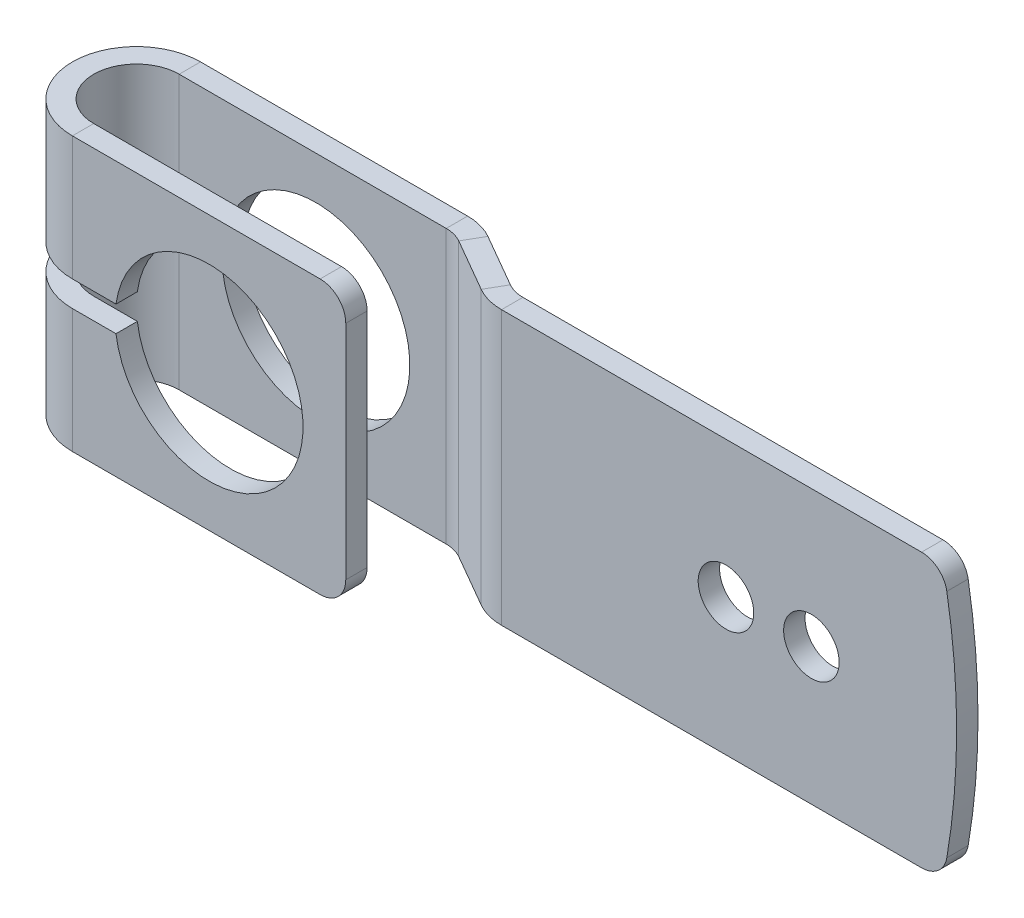
ISO-10303-21;
HEADER;
FILE_DESCRIPTION(('STEP AP214'),'2;1');
FILE_NAME('part.step','',(''),(''),'','','');
FILE_SCHEMA(('AUTOMOTIVE_DESIGN { 1 0 10303 214 1 1 1 1 }'));
ENDSEC;
DATA;
#1=APPLICATION_CONTEXT('core data for automotive mechanical design processes');
#2=APPLICATION_PROTOCOL_DEFINITION('international standard','automotive_design',2000,#1);
#3=PRODUCT_CONTEXT('',#1,'mechanical');
#4=PRODUCT('Part','Part','',(#3));
#5=PRODUCT_RELATED_PRODUCT_CATEGORY('part','',(#4));
#6=PRODUCT_DEFINITION_FORMATION('','',#4);
#7=PRODUCT_DEFINITION_CONTEXT('part definition',#1,'design');
#8=PRODUCT_DEFINITION('design','',#6,#7);
#9=PRODUCT_DEFINITION_SHAPE('','',#8);
#10=(LENGTH_UNIT() NAMED_UNIT(*) SI_UNIT(.MILLI.,.METRE.));
#11=(NAMED_UNIT(*) PLANE_ANGLE_UNIT() SI_UNIT($,.RADIAN.));
#12=(NAMED_UNIT(*) SI_UNIT($,.STERADIAN.) SOLID_ANGLE_UNIT());
#13=UNCERTAINTY_MEASURE_WITH_UNIT(LENGTH_MEASURE(1.E-05),#10,'distance_accuracy_value','');
#14=(GEOMETRIC_REPRESENTATION_CONTEXT(3) GLOBAL_UNCERTAINTY_ASSIGNED_CONTEXT((#13)) GLOBAL_UNIT_ASSIGNED_CONTEXT((#10,
#11,#12)) REPRESENTATION_CONTEXT('',''));
#15=CARTESIAN_POINT('',(0.,0.,0.));
#16=DIRECTION('',(0.,0.,1.));
#17=DIRECTION('',(1.,0.,0.));
#18=AXIS2_PLACEMENT_3D('',#15,#16,#17);
#19=CARTESIAN_POINT('',(39.4820508075688,16.,-0.870834875401152));
#20=DIRECTION('',(0.,1.,0.));
#21=DIRECTION('',(0.,0.,1.));
#22=AXIS2_PLACEMENT_3D('',#19,#20,#21);
#23=PLANE('',#22);
#24=DIRECTION('',(1.,0.,0.));
#25=VECTOR('',#24,1.);
#26=CARTESIAN_POINT('',(41.6602540378444,16.,0.));
#27=LINE('',#26,#25);
#28=CARTESIAN_POINT('',(91.8946638440411,16.,0.));
#29=VERTEX_POINT('',#28);
#30=CARTESIAN_POINT('',(42.7320508075689,16.,0.));
#31=VERTEX_POINT('',#30);
#32=EDGE_CURVE('E341',#29,#31,#27,.F.);
#33=ORIENTED_EDGE('',*,*,#32,.F.);
#34=DIRECTION('',(0.,0.,-1.));
#35=VECTOR('',#34,1.);
#36=CARTESIAN_POINT('',(91.8946638440411,16.,-0.870834875401152));
#37=LINE('',#36,#35);
#38=CARTESIAN_POINT('',(91.8946638440411,16.,-2.5));
#39=VERTEX_POINT('',#38);
#40=EDGE_CURVE('E11',#29,#39,#37,.T.);
#41=ORIENTED_EDGE('',*,*,#40,.T.);
#42=DIRECTION('',(-1.,0.,0.));
#43=VECTOR('',#42,1.);
#44=CARTESIAN_POINT('',(41.6602540378444,16.,-2.5));
#45=LINE('',#44,#43);
#46=CARTESIAN_POINT('',(42.7320508075689,16.,-2.5));
#47=VERTEX_POINT('',#46);
#48=EDGE_CURVE('E344',#39,#47,#45,.T.);
#49=ORIENTED_EDGE('',*,*,#48,.T.);
#50=DIRECTION('',(0.,0.,1.));
#51=VECTOR('',#50,1.);
#52=CARTESIAN_POINT('',(42.7320508075689,16.,-2.5));
#53=LINE('',#52,#51);
#54=EDGE_CURVE('E499',#47,#31,#53,.T.);
#55=ORIENTED_EDGE('',*,*,#54,.T.);
#56=EDGE_LOOP('',(#33,#41,#49,#55));
#57=FACE_BOUND('',#56,.T.);
#58=ADVANCED_FACE('F45',(#57),#23,.T.);
#59=CARTESIAN_POINT('',(0.,-16.,0.));
#60=DIRECTION('',(0.,1.,0.));
#61=DIRECTION('',(1.,0.,0.));
#62=AXIS2_PLACEMENT_3D('',#59,#60,#61);
#63=PLANE('',#62);
#64=DIRECTION('',(-1.,0.,0.));
#65=VECTOR('',#64,1.);
#66=CARTESIAN_POINT('',(41.6602540378444,-16.,-2.5));
#67=LINE('',#66,#65);
#68=CARTESIAN_POINT('',(91.8946638440411,-16.,-2.5));
#69=VERTEX_POINT('',#68);
#70=CARTESIAN_POINT('',(42.7320508075689,-16.,-2.5));
#71=VERTEX_POINT('',#70);
#72=EDGE_CURVE('E398',#69,#71,#67,.T.);
#73=ORIENTED_EDGE('',*,*,#72,.F.);
#74=DIRECTION('',(0.,0.,1.));
#75=VECTOR('',#74,1.);
#76=CARTESIAN_POINT('',(91.8946638440411,-16.,0.));
#77=LINE('',#76,#75);
#78=CARTESIAN_POINT('',(91.8946638440411,-16.,0.));
#79=VERTEX_POINT('',#78);
#80=EDGE_CURVE('E69',#69,#79,#77,.T.);
#81=ORIENTED_EDGE('',*,*,#80,.T.);
#82=DIRECTION('',(1.,0.,0.));
#83=VECTOR('',#82,1.);
#84=CARTESIAN_POINT('',(41.6602540378444,-16.,0.));
#85=LINE('',#84,#83);
#86=CARTESIAN_POINT('',(42.7320508075689,-16.,0.));
#87=VERTEX_POINT('',#86);
#88=EDGE_CURVE('E395',#79,#87,#85,.F.);
#89=ORIENTED_EDGE('',*,*,#88,.T.);
#90=DIRECTION('',(0.,0.,-1.));
#91=VECTOR('',#90,1.);
#92=CARTESIAN_POINT('',(42.7320508075689,-16.,0.));
#93=LINE('',#92,#91);
#94=EDGE_CURVE('E489',#87,#71,#93,.T.);
#95=ORIENTED_EDGE('',*,*,#94,.T.);
#96=EDGE_LOOP('',(#73,#81,#89,#95));
#97=FACE_BOUND('',#96,.T.);
#98=ADVANCED_FACE('F586',(#97),#63,.F.);
#99=CARTESIAN_POINT('',(0.,16.,7.5));
#100=DIRECTION('',(0.,0.,-1.));
#101=DIRECTION('',(-1.,0.,0.));
#102=AXIS2_PLACEMENT_3D('',#99,#100,#101);
#103=PLANE('',#102);
#104=DIRECTION('',(1.,0.,0.));
#105=VECTOR('',#104,1.);
#106=CARTESIAN_POINT('',(0.,-16.,7.5));
#107=LINE('',#106,#105);
#108=CARTESIAN_POINT('',(0.,-16.,7.5));
#109=VERTEX_POINT('',#108);
#110=CARTESIAN_POINT('',(29.,-16.,7.5));
#111=VERTEX_POINT('',#110);
#112=EDGE_CURVE('E311',#109,#111,#107,.T.);
#113=ORIENTED_EDGE('',*,*,#112,.T.);
#114=CARTESIAN_POINT('',(29.,-13.,7.5));
#115=DIRECTION('',(0.,0.,-1.));
#116=DIRECTION('',(-1.,0.,0.));
#117=AXIS2_PLACEMENT_3D('',#114,#115,#116);
#118=CIRCLE('',#117,3.);
#119=CARTESIAN_POINT('',(32.,-13.,7.5));
#120=VERTEX_POINT('',#119);
#121=EDGE_CURVE('E530',#111,#120,#118,.F.);
#122=ORIENTED_EDGE('',*,*,#121,.T.);
#123=DIRECTION('',(0.,-1.,0.));
#124=VECTOR('',#123,1.);
#125=CARTESIAN_POINT('',(32.,16.,7.5));
#126=LINE('',#125,#124);
#127=CARTESIAN_POINT('',(32.,13.,7.5));
#128=VERTEX_POINT('',#127);
#129=EDGE_CURVE('E473',#128,#120,#126,.T.);
#130=ORIENTED_EDGE('',*,*,#129,.F.);
#131=CARTESIAN_POINT('',(29.,13.,7.5));
#132=DIRECTION('',(0.,0.,-1.));
#133=DIRECTION('',(-1.,0.,0.));
#134=AXIS2_PLACEMENT_3D('',#131,#132,#133);
#135=CIRCLE('',#134,3.);
#136=CARTESIAN_POINT('',(29.,16.,7.5));
#137=VERTEX_POINT('',#136);
#138=EDGE_CURVE('E527',#128,#137,#135,.F.);
#139=ORIENTED_EDGE('',*,*,#138,.T.);
#140=DIRECTION('',(1.,0.,0.));
#141=VECTOR('',#140,1.);
#142=CARTESIAN_POINT('',(0.,16.,7.5));
#143=LINE('',#142,#141);
#144=CARTESIAN_POINT('',(0.,16.,7.5));
#145=VERTEX_POINT('',#144);
#146=EDGE_CURVE('E312',#145,#137,#143,.T.);
#147=ORIENTED_EDGE('',*,*,#146,.F.);
#148=DIRECTION('',(0.,-1.,0.));
#149=VECTOR('',#148,1.);
#150=CARTESIAN_POINT('',(0.,16.,7.5));
#151=LINE('',#150,#149);
#152=CARTESIAN_POINT('',(0.,1.5,7.5));
#153=VERTEX_POINT('',#152);
#154=EDGE_CURVE('E419',#145,#153,#151,.T.);
#155=ORIENTED_EDGE('',*,*,#154,.T.);
#156=DIRECTION('',(1.,0.,0.));
#157=VECTOR('',#156,1.);
#158=CARTESIAN_POINT('',(0.,1.5,7.5));
#159=LINE('',#158,#157);
#160=CARTESIAN_POINT('',(5.10275264114832,1.5,7.5));
#161=VERTEX_POINT('',#160);
#162=EDGE_CURVE('E262',#153,#161,#159,.T.);
#163=ORIENTED_EDGE('',*,*,#162,.T.);
#164=CARTESIAN_POINT('',(16.,0.,7.5));
#165=DIRECTION('',(0.,0.,1.));
#166=DIRECTION('',(1.,0.,0.));
#167=AXIS2_PLACEMENT_3D('',#164,#165,#166);
#168=CIRCLE('',#167,11.);
#169=CARTESIAN_POINT('',(5.10275264114832,-1.5,7.5));
#170=VERTEX_POINT('',#169);
#171=EDGE_CURVE('E267',#170,#161,#168,.T.);
#172=ORIENTED_EDGE('',*,*,#171,.F.);
#173=DIRECTION('',(1.,0.,0.));
#174=VECTOR('',#173,1.);
#175=CARTESIAN_POINT('',(0.,-1.5,7.5));
#176=LINE('',#175,#174);
#177=CARTESIAN_POINT('',(0.,-1.5,7.5));
#178=VERTEX_POINT('',#177);
#179=EDGE_CURVE('E275',#178,#170,#176,.T.);
#180=ORIENTED_EDGE('',*,*,#179,.F.);
#181=EDGE_CURVE('E367',#178,#109,#151,.T.);
#182=ORIENTED_EDGE('',*,*,#181,.T.);
#183=EDGE_LOOP('',(#113,#122,#130,#139,#147,#155,#163,#172,#180,#182));
#184=FACE_BOUND('',#183,.T.);
#185=ADVANCED_FACE('F651',(#184),#103,.F.);
#186=CARTESIAN_POINT('',(0.,16.,5.));
#187=DIRECTION('',(0.,0.,-1.));
#188=DIRECTION('',(-1.,0.,0.));
#189=AXIS2_PLACEMENT_3D('',#186,#187,#188);
#190=PLANE('',#189);
#191=DIRECTION('',(0.,-1.,0.));
#192=VECTOR('',#191,1.);
#193=CARTESIAN_POINT('',(32.,16.,5.));
#194=LINE('',#193,#192);
#195=CARTESIAN_POINT('',(32.,13.,5.));
#196=VERTEX_POINT('',#195);
#197=CARTESIAN_POINT('',(32.,-13.,5.));
#198=VERTEX_POINT('',#197);
#199=EDGE_CURVE('E469',#196,#198,#194,.T.);
#200=ORIENTED_EDGE('',*,*,#199,.T.);
#201=CARTESIAN_POINT('',(29.,-13.,5.));
#202=DIRECTION('',(0.,0.,-1.));
#203=DIRECTION('',(-1.,0.,0.));
#204=AXIS2_PLACEMENT_3D('',#201,#202,#203);
#205=CIRCLE('',#204,3.);
#206=CARTESIAN_POINT('',(29.,-16.,5.));
#207=VERTEX_POINT('',#206);
#208=EDGE_CURVE('E543',#198,#207,#205,.T.);
#209=ORIENTED_EDGE('',*,*,#208,.T.);
#210=DIRECTION('',(1.,0.,0.));
#211=VECTOR('',#210,1.);
#212=CARTESIAN_POINT('',(0.,-16.,5.));
#213=LINE('',#212,#211);
#214=CARTESIAN_POINT('',(0.,-16.,5.));
#215=VERTEX_POINT('',#214);
#216=EDGE_CURVE('E371',#215,#207,#213,.T.);
#217=ORIENTED_EDGE('',*,*,#216,.F.);
#218=DIRECTION('',(0.,-1.,0.));
#219=VECTOR('',#218,1.);
#220=CARTESIAN_POINT('',(0.,16.,5.));
#221=LINE('',#220,#219);
#222=CARTESIAN_POINT('',(0.,-1.5,5.));
#223=VERTEX_POINT('',#222);
#224=EDGE_CURVE('E464',#223,#215,#221,.T.);
#225=ORIENTED_EDGE('',*,*,#224,.F.);
#226=DIRECTION('',(-1.,0.,0.));
#227=VECTOR('',#226,1.);
#228=CARTESIAN_POINT('',(0.,-1.5,5.));
#229=LINE('',#228,#227);
#230=CARTESIAN_POINT('',(5.10275264114832,-1.5,5.));
#231=VERTEX_POINT('',#230);
#232=EDGE_CURVE('E290',#231,#223,#229,.T.);
#233=ORIENTED_EDGE('',*,*,#232,.F.);
#234=CARTESIAN_POINT('',(16.,0.,5.));
#235=DIRECTION('',(0.,0.,-1.));
#236=DIRECTION('',(-1.,0.,0.));
#237=AXIS2_PLACEMENT_3D('',#234,#235,#236);
#238=CIRCLE('',#237,11.);
#239=CARTESIAN_POINT('',(5.10275264114832,1.5,5.));
#240=VERTEX_POINT('',#239);
#241=EDGE_CURVE('E308',#240,#231,#238,.T.);
#242=ORIENTED_EDGE('',*,*,#241,.F.);
#243=DIRECTION('',(-1.,0.,0.));
#244=VECTOR('',#243,1.);
#245=CARTESIAN_POINT('',(0.,1.5,5.));
#246=LINE('',#245,#244);
#247=CARTESIAN_POINT('',(0.,1.5,5.));
#248=VERTEX_POINT('',#247);
#249=EDGE_CURVE('E301',#240,#248,#246,.T.);
#250=ORIENTED_EDGE('',*,*,#249,.T.);
#251=CARTESIAN_POINT('',(0.,16.,5.));
#252=VERTEX_POINT('',#251);
#253=EDGE_CURVE('E465',#252,#248,#221,.T.);
#254=ORIENTED_EDGE('',*,*,#253,.F.);
#255=DIRECTION('',(1.,0.,0.));
#256=VECTOR('',#255,1.);
#257=CARTESIAN_POINT('',(0.,16.,5.));
#258=LINE('',#257,#256);
#259=CARTESIAN_POINT('',(29.,16.,5.));
#260=VERTEX_POINT('',#259);
#261=EDGE_CURVE('E316',#252,#260,#258,.T.);
#262=ORIENTED_EDGE('',*,*,#261,.T.);
#263=CARTESIAN_POINT('',(29.,13.,5.));
#264=DIRECTION('',(0.,0.,-1.));
#265=DIRECTION('',(-1.,0.,0.));
#266=AXIS2_PLACEMENT_3D('',#263,#264,#265);
#267=CIRCLE('',#266,3.);
#268=EDGE_CURVE('E540',#260,#196,#267,.T.);
#269=ORIENTED_EDGE('',*,*,#268,.T.);
#270=EDGE_LOOP('',(#200,#209,#217,#225,#233,#242,#250,#254,#262,#269));
#271=FACE_BOUND('',#270,.T.);
#272=ADVANCED_FACE('F688',(#271),#190,.T.);
#273=CARTESIAN_POINT('',(0.,16.,0.));
#274=DIRECTION('',(0.,-1.,0.));
#275=DIRECTION('',(0.,0.,-1.));
#276=AXIS2_PLACEMENT_3D('',#273,#274,#275);
#277=CYLINDRICAL_SURFACE('',#276,5.);
#278=ORIENTED_EDGE('',*,*,#253,.T.);
#279=CARTESIAN_POINT('',(0.,1.5,0.));
#280=DIRECTION('',(0.,-1.,0.));
#281=DIRECTION('',(1.,0.,0.));
#282=AXIS2_PLACEMENT_3D('',#279,#280,#281);
#283=CIRCLE('',#282,5.);
#284=CARTESIAN_POINT('',(0.,1.5,-5.));
#285=VERTEX_POINT('',#284);
#286=EDGE_CURVE('E297',#248,#285,#283,.T.);
#287=ORIENTED_EDGE('',*,*,#286,.T.);
#288=DIRECTION('',(0.,-1.,0.));
#289=VECTOR('',#288,1.);
#290=CARTESIAN_POINT('',(0.,16.,-5.));
#291=LINE('',#290,#289);
#292=CARTESIAN_POINT('',(0.,16.,-5.));
#293=VERTEX_POINT('',#292);
#294=EDGE_CURVE('E460',#293,#285,#291,.T.);
#295=ORIENTED_EDGE('',*,*,#294,.F.);
#296=CARTESIAN_POINT('',(0.,16.,0.));
#297=DIRECTION('',(0.,1.,0.));
#298=DIRECTION('',(1.,0.,0.));
#299=AXIS2_PLACEMENT_3D('',#296,#297,#298);
#300=CIRCLE('',#299,5.);
#301=EDGE_CURVE('E321',#293,#252,#300,.T.);
#302=ORIENTED_EDGE('',*,*,#301,.T.);
#303=EDGE_LOOP('',(#278,#287,#295,#302));
#304=FACE_BOUND('',#303,.T.);
#305=ADVANCED_FACE('F830',(#304),#277,.F.);
#306=CARTESIAN_POINT('',(0.,16.,-5.));
#307=DIRECTION('',(0.,0.,1.));
#308=DIRECTION('',(1.,0.,0.));
#309=AXIS2_PLACEMENT_3D('',#306,#307,#308);
#310=PLANE('',#309);
#311=ORIENTED_EDGE('',*,*,#294,.T.);
#312=DIRECTION('',(1.,0.,0.));
#313=VECTOR('',#312,1.);
#314=CARTESIAN_POINT('',(0.,1.5,-5.));
#315=LINE('',#314,#313);
#316=CARTESIAN_POINT('',(5.10275264114832,1.5,-5.));
#317=VERTEX_POINT('',#316);
#318=EDGE_CURVE('E293',#285,#317,#315,.T.);
#319=ORIENTED_EDGE('',*,*,#318,.T.);
#320=CARTESIAN_POINT('',(16.,0.,-5.));
#321=DIRECTION('',(0.,0.,1.));
#322=DIRECTION('',(1.,0.,0.));
#323=AXIS2_PLACEMENT_3D('',#320,#321,#322);
#324=CIRCLE('',#323,11.);
#325=CARTESIAN_POINT('',(5.10275264114832,-1.5,-5.));
#326=VERTEX_POINT('',#325);
#327=EDGE_CURVE('E305',#326,#317,#324,.T.);
#328=ORIENTED_EDGE('',*,*,#327,.F.);
#329=DIRECTION('',(1.,0.,0.));
#330=VECTOR('',#329,1.);
#331=CARTESIAN_POINT('',(0.,-1.5,-5.));
#332=LINE('',#331,#330);
#333=CARTESIAN_POINT('',(0.,-1.5,-5.));
#334=VERTEX_POINT('',#333);
#335=EDGE_CURVE('E239',#334,#326,#332,.T.);
#336=ORIENTED_EDGE('',*,*,#335,.F.);
#337=CARTESIAN_POINT('',(0.,-16.,-5.));
#338=VERTEX_POINT('',#337);
#339=EDGE_CURVE('E459',#334,#338,#291,.T.);
#340=ORIENTED_EDGE('',*,*,#339,.T.);
#341=DIRECTION('',(1.,0.,0.));
#342=VECTOR('',#341,1.);
#343=CARTESIAN_POINT('',(0.,-16.,-5.));
#344=LINE('',#343,#342);
#345=CARTESIAN_POINT('',(31.2583302491977,-16.,-5.));
#346=VERTEX_POINT('',#345);
#347=EDGE_CURVE('E379',#346,#338,#344,.F.);
#348=ORIENTED_EDGE('',*,*,#347,.F.);
#349=DIRECTION('',(0.,-1.,0.));
#350=VECTOR('',#349,1.);
#351=CARTESIAN_POINT('',(31.2583302491977,16.,-5.));
#352=LINE('',#351,#350);
#353=CARTESIAN_POINT('',(31.2583302491977,16.,-5.));
#354=VERTEX_POINT('',#353);
#355=EDGE_CURVE('E455',#354,#346,#352,.T.);
#356=ORIENTED_EDGE('',*,*,#355,.F.);
#357=DIRECTION('',(1.,0.,0.));
#358=VECTOR('',#357,1.);
#359=CARTESIAN_POINT('',(0.,16.,-5.));
#360=LINE('',#359,#358);
#361=EDGE_CURVE('E325',#354,#293,#360,.F.);
#362=ORIENTED_EDGE('',*,*,#361,.T.);
#363=EDGE_LOOP('',(#311,#319,#328,#336,#340,#348,#356,#362));
#364=FACE_BOUND('',#363,.T.);
#365=ADVANCED_FACE('F716',(#364),#310,.T.);
#366=CARTESIAN_POINT('',(0.,16.,-7.5));
#367=DIRECTION('',(0.,0.,1.));
#368=DIRECTION('',(1.,0.,0.));
#369=AXIS2_PLACEMENT_3D('',#366,#367,#368);
#370=PLANE('',#369);
#371=DIRECTION('',(1.,0.,0.));
#372=VECTOR('',#371,1.);
#373=CARTESIAN_POINT('',(0.,1.5,-7.5));
#374=LINE('',#373,#372);
#375=CARTESIAN_POINT('',(0.,1.5,-7.5));
#376=VERTEX_POINT('',#375);
#377=CARTESIAN_POINT('',(5.10275264114832,1.5,-7.5));
#378=VERTEX_POINT('',#377);
#379=EDGE_CURVE('E255',#376,#378,#374,.T.);
#380=ORIENTED_EDGE('',*,*,#379,.F.);
#381=DIRECTION('',(0.,-1.,0.));
#382=VECTOR('',#381,1.);
#383=CARTESIAN_POINT('',(0.,16.,-7.5));
#384=LINE('',#383,#382);
#385=CARTESIAN_POINT('',(0.,16.,-7.5));
#386=VERTEX_POINT('',#385);
#387=EDGE_CURVE('E423',#386,#376,#384,.T.);
#388=ORIENTED_EDGE('',*,*,#387,.F.);
#389=DIRECTION('',(-1.,0.,0.));
#390=VECTOR('',#389,1.);
#391=CARTESIAN_POINT('',(0.,16.,-7.5));
#392=LINE('',#391,#390);
#393=CARTESIAN_POINT('',(31.2583302491977,16.,-7.5));
#394=VERTEX_POINT('',#393);
#395=EDGE_CURVE('E359',#394,#386,#392,.T.);
#396=ORIENTED_EDGE('',*,*,#395,.F.);
#397=DIRECTION('',(0.,-1.,0.));
#398=VECTOR('',#397,1.);
#399=CARTESIAN_POINT('',(31.2583302491977,16.,-7.5));
#400=LINE('',#399,#398);
#401=CARTESIAN_POINT('',(31.2583302491977,-16.,-7.5));
#402=VERTEX_POINT('',#401);
#403=EDGE_CURVE('E427',#394,#402,#400,.T.);
#404=ORIENTED_EDGE('',*,*,#403,.T.);
#405=DIRECTION('',(-1.,0.,0.));
#406=VECTOR('',#405,1.);
#407=CARTESIAN_POINT('',(0.,-16.,-7.5));
#408=LINE('',#407,#406);
#409=CARTESIAN_POINT('',(0.,-16.,-7.5));
#410=VERTEX_POINT('',#409);
#411=EDGE_CURVE('E413',#402,#410,#408,.T.);
#412=ORIENTED_EDGE('',*,*,#411,.T.);
#413=CARTESIAN_POINT('',(0.,-1.5,-7.5));
#414=VERTEX_POINT('',#413);
#415=EDGE_CURVE('E260',#414,#410,#384,.T.);
#416=ORIENTED_EDGE('',*,*,#415,.F.);
#417=DIRECTION('',(1.,0.,0.));
#418=VECTOR('',#417,1.);
#419=CARTESIAN_POINT('',(0.,-1.5,-7.5));
#420=LINE('',#419,#418);
#421=CARTESIAN_POINT('',(5.10275264114832,-1.5,-7.5));
#422=VERTEX_POINT('',#421);
#423=EDGE_CURVE('E236',#414,#422,#420,.T.);
#424=ORIENTED_EDGE('',*,*,#423,.T.);
#425=CARTESIAN_POINT('',(16.,0.,-7.5));
#426=DIRECTION('',(0.,0.,1.));
#427=DIRECTION('',(1.,0.,0.));
#428=AXIS2_PLACEMENT_3D('',#425,#426,#427);
#429=CIRCLE('',#428,11.);
#430=EDGE_CURVE('E248',#422,#378,#429,.T.);
#431=ORIENTED_EDGE('',*,*,#430,.T.);
#432=EDGE_LOOP('',(#380,#388,#396,#404,#412,#416,#424,#431));
#433=FACE_BOUND('',#432,.T.);
#434=ADVANCED_FACE('F258',(#433),#370,.F.);
#435=CARTESIAN_POINT('',(0.,16.,0.));
#436=DIRECTION('',(0.,-1.,0.));
#437=DIRECTION('',(0.,0.,-1.));
#438=AXIS2_PLACEMENT_3D('',#435,#436,#437);
#439=CYLINDRICAL_SURFACE('',#438,7.5);
#440=CARTESIAN_POINT('',(0.,1.5,0.));
#441=DIRECTION('',(0.,-1.,0.));
#442=DIRECTION('',(1.,0.,0.));
#443=AXIS2_PLACEMENT_3D('',#440,#441,#442);
#444=CIRCLE('',#443,7.5);
#445=EDGE_CURVE('E520',#153,#376,#444,.T.);
#446=ORIENTED_EDGE('',*,*,#445,.F.);
#447=ORIENTED_EDGE('',*,*,#154,.F.);
#448=CARTESIAN_POINT('',(0.,16.,0.));
#449=DIRECTION('',(0.,1.,0.));
#450=DIRECTION('',(0.,0.,1.));
#451=AXIS2_PLACEMENT_3D('',#448,#449,#450);
#452=CIRCLE('',#451,7.5);
#453=EDGE_CURVE('E363',#386,#145,#452,.T.);
#454=ORIENTED_EDGE('',*,*,#453,.F.);
#455=ORIENTED_EDGE('',*,*,#387,.T.);
#456=EDGE_LOOP('',(#446,#447,#454,#455));
#457=FACE_BOUND('',#456,.T.);
#458=ADVANCED_FACE('F673',(#457),#439,.T.);
#459=CARTESIAN_POINT('',(0.,16.,-7.5));
#460=DIRECTION('',(0.,1.,0.));
#461=DIRECTION('',(0.,0.,1.));
#462=AXIS2_PLACEMENT_3D('',#459,#460,#461);
#463=PLANE('',#462);
#464=DIRECTION('',(0.,0.,1.));
#465=VECTOR('',#464,1.);
#466=CARTESIAN_POINT('',(0.,16.,-7.5));
#467=LINE('',#466,#465);
#468=EDGE_CURVE('E514',#386,#293,#467,.T.);
#469=ORIENTED_EDGE('',*,*,#468,.F.);
#470=ORIENTED_EDGE('',*,*,#453,.T.);
#471=DIRECTION('',(0.,0.,1.));
#472=VECTOR('',#471,1.);
#473=CARTESIAN_POINT('',(0.,16.,5.));
#474=LINE('',#473,#472);
#475=EDGE_CURVE('E511',#252,#145,#474,.T.);
#476=ORIENTED_EDGE('',*,*,#475,.F.);
#477=ORIENTED_EDGE('',*,*,#301,.F.);
#478=EDGE_LOOP('',(#469,#470,#476,#477));
#479=FACE_BOUND('',#478,.T.);
#480=ADVANCED_FACE('F669',(#479),#463,.T.);
#481=CARTESIAN_POINT('',(0.,16.,5.));
#482=DIRECTION('',(0.,1.,0.));
#483=DIRECTION('',(0.,0.,1.));
#484=AXIS2_PLACEMENT_3D('',#481,#482,#483);
#485=PLANE('',#484);
#486=ORIENTED_EDGE('',*,*,#395,.T.);
#487=ORIENTED_EDGE('',*,*,#468,.T.);
#488=ORIENTED_EDGE('',*,*,#361,.F.);
#489=DIRECTION('',(0.,0.,-1.));
#490=VECTOR('',#489,1.);
#491=CARTESIAN_POINT('',(31.2583302491977,16.,-5.));
#492=LINE('',#491,#490);
#493=EDGE_CURVE('E483',#354,#394,#492,.T.);
#494=ORIENTED_EDGE('',*,*,#493,.T.);
#495=EDGE_LOOP('',(#486,#487,#488,#494));
#496=FACE_BOUND('',#495,.T.);
#497=ADVANCED_FACE('F665',(#496),#485,.T.);
#498=CARTESIAN_POINT('',(0.,-16.,7.5));
#499=DIRECTION('',(0.,-1.,0.));
#500=DIRECTION('',(0.,0.,-1.));
#501=AXIS2_PLACEMENT_3D('',#498,#499,#500);
#502=PLANE('',#501);
#503=DIRECTION('',(0.,0.,-1.));
#504=VECTOR('',#503,1.);
#505=CARTESIAN_POINT('',(0.,-16.,7.5));
#506=LINE('',#505,#504);
#507=EDGE_CURVE('E507',#109,#215,#506,.T.);
#508=ORIENTED_EDGE('',*,*,#507,.F.);
#509=CARTESIAN_POINT('',(0.,-16.,0.));
#510=DIRECTION('',(0.,1.,0.));
#511=DIRECTION('',(0.,0.,1.));
#512=AXIS2_PLACEMENT_3D('',#509,#510,#511);
#513=CIRCLE('',#512,7.5);
#514=EDGE_CURVE('E317',#410,#109,#513,.T.);
#515=ORIENTED_EDGE('',*,*,#514,.F.);
#516=DIRECTION('',(0.,0.,-1.));
#517=VECTOR('',#516,1.);
#518=CARTESIAN_POINT('',(0.,-16.,-5.));
#519=LINE('',#518,#517);
#520=EDGE_CURVE('E503',#338,#410,#519,.T.);
#521=ORIENTED_EDGE('',*,*,#520,.F.);
#522=CARTESIAN_POINT('',(0.,-16.,0.));
#523=DIRECTION('',(0.,1.,0.));
#524=DIRECTION('',(1.,0.,0.));
#525=AXIS2_PLACEMENT_3D('',#522,#523,#524);
#526=CIRCLE('',#525,5.);
#527=EDGE_CURVE('E375',#338,#215,#526,.T.);
#528=ORIENTED_EDGE('',*,*,#527,.T.);
#529=EDGE_LOOP('',(#508,#515,#521,#528));
#530=FACE_BOUND('',#529,.T.);
#531=ADVANCED_FACE('F661',(#530),#502,.T.);
#532=CARTESIAN_POINT('',(0.,-16.,-5.));
#533=DIRECTION('',(0.,-1.,0.));
#534=DIRECTION('',(0.,0.,-1.));
#535=AXIS2_PLACEMENT_3D('',#532,#533,#534);
#536=PLANE('',#535);
#537=ORIENTED_EDGE('',*,*,#216,.T.);
#538=DIRECTION('',(0.,0.,1.));
#539=VECTOR('',#538,1.);
#540=CARTESIAN_POINT('',(29.,-16.,-5.));
#541=LINE('',#540,#539);
#542=EDGE_CURVE('E523',#207,#111,#541,.T.);
#543=ORIENTED_EDGE('',*,*,#542,.T.);
#544=ORIENTED_EDGE('',*,*,#112,.F.);
#545=ORIENTED_EDGE('',*,*,#507,.T.);
#546=EDGE_LOOP('',(#537,#543,#544,#545));
#547=FACE_BOUND('',#546,.T.);
#548=ADVANCED_FACE('F658',(#547),#536,.T.);
#549=CARTESIAN_POINT('',(42.7320508075689,16.,-2.5));
#550=DIRECTION('',(0.,1.,0.));
#551=DIRECTION('',(0.,0.,1.));
#552=AXIS2_PLACEMENT_3D('',#549,#550,#551);
#553=PLANE('',#552);
#554=ORIENTED_EDGE('',*,*,#54,.F.);
#555=CARTESIAN_POINT('',(42.7320508075689,16.,-6.5));
#556=DIRECTION('',(0.,1.,0.));
#557=DIRECTION('',(0.,0.,1.));
#558=AXIS2_PLACEMENT_3D('',#555,#556,#557);
#559=CIRCLE('',#558,4.);
#560=CARTESIAN_POINT('',(40.7320508075689,16.,-3.03589838486225));
#561=VERTEX_POINT('',#560);
#562=EDGE_CURVE('E347',#47,#561,#559,.F.);
#563=ORIENTED_EDGE('',*,*,#562,.T.);
#564=DIRECTION('',(0.500000000000001,0.,-0.866025403784438));
#565=VECTOR('',#564,1.);
#566=CARTESIAN_POINT('',(39.4820508075688,16.,-0.870834875401152));
#567=LINE('',#566,#565);
#568=CARTESIAN_POINT('',(39.4820508075688,16.,-0.870834875401152));
#569=VERTEX_POINT('',#568);
#570=EDGE_CURVE('E496',#569,#561,#567,.T.);
#571=ORIENTED_EDGE('',*,*,#570,.F.);
#572=CARTESIAN_POINT('',(42.7320508075689,16.,-6.5));
#573=DIRECTION('',(0.,1.,0.));
#574=DIRECTION('',(1.,0.,0.));
#575=AXIS2_PLACEMENT_3D('',#572,#573,#574);
#576=CIRCLE('',#575,6.5);
#577=EDGE_CURVE('E337',#31,#569,#576,.F.);
#578=ORIENTED_EDGE('',*,*,#577,.F.);
#579=EDGE_LOOP('',(#554,#563,#571,#578));
#580=FACE_BOUND('',#579,.T.);
#581=ADVANCED_FACE('F634',(#580),#553,.T.);
#582=CARTESIAN_POINT('',(40.7320508075689,-16.,-3.03589838486225));
#583=DIRECTION('',(0.,-1.,0.));
#584=DIRECTION('',(0.,0.,-1.));
#585=AXIS2_PLACEMENT_3D('',#582,#583,#584);
#586=PLANE('',#585);
#587=DIRECTION('',(-0.500000000000001,0.,0.866025403784438));
#588=VECTOR('',#587,1.);
#589=CARTESIAN_POINT('',(40.7320508075689,-16.,-3.03589838486225));
#590=LINE('',#589,#588);
#591=CARTESIAN_POINT('',(40.7320508075689,-16.,-3.03589838486225));
#592=VERTEX_POINT('',#591);
#593=CARTESIAN_POINT('',(39.4820508075688,-16.,-0.870834875401152));
#594=VERTEX_POINT('',#593);
#595=EDGE_CURVE('E493',#592,#594,#590,.T.);
#596=ORIENTED_EDGE('',*,*,#595,.F.);
#597=CARTESIAN_POINT('',(42.7320508075689,-16.,-6.5));
#598=DIRECTION('',(0.,1.,0.));
#599=DIRECTION('',(0.,0.,1.));
#600=AXIS2_PLACEMENT_3D('',#597,#598,#599);
#601=CIRCLE('',#600,4.);
#602=EDGE_CURVE('E401',#71,#592,#601,.F.);
#603=ORIENTED_EDGE('',*,*,#602,.F.);
#604=ORIENTED_EDGE('',*,*,#94,.F.);
#605=CARTESIAN_POINT('',(42.7320508075689,-16.,-6.5));
#606=DIRECTION('',(0.,1.,0.));
#607=DIRECTION('',(1.,0.,0.));
#608=AXIS2_PLACEMENT_3D('',#605,#606,#607);
#609=CIRCLE('',#608,6.5);
#610=EDGE_CURVE('E391',#87,#594,#609,.F.);
#611=ORIENTED_EDGE('',*,*,#610,.T.);
#612=EDGE_LOOP('',(#596,#603,#604,#611));
#613=FACE_BOUND('',#612,.T.);
#614=ADVANCED_FACE('F595',(#613),#586,.T.);
#615=CARTESIAN_POINT('',(42.7320508075689,-16.,0.));
#616=DIRECTION('',(0.,-1.,0.));
#617=DIRECTION('',(0.,0.,-1.));
#618=AXIS2_PLACEMENT_3D('',#615,#616,#617);
#619=PLANE('',#618);
#620=DIRECTION('',(-0.866025403784438,0.,-0.500000000000001));
#621=VECTOR('',#620,1.);
#622=CARTESIAN_POINT('',(33.,-16.,-7.5));
#623=LINE('',#622,#621);
#624=CARTESIAN_POINT('',(34.5083302491977,-16.,-6.62916512459884));
#625=VERTEX_POINT('',#624);
#626=EDGE_CURVE('E405',#592,#625,#623,.T.);
#627=ORIENTED_EDGE('',*,*,#626,.F.);
#628=ORIENTED_EDGE('',*,*,#595,.T.);
#629=DIRECTION('',(-0.866025403784438,0.,-0.500000000000001));
#630=VECTOR('',#629,1.);
#631=CARTESIAN_POINT('',(31.75,-16.,-5.3349364905389));
#632=LINE('',#631,#630);
#633=CARTESIAN_POINT('',(33.2583302491977,-16.,-4.46410161513775));
#634=VERTEX_POINT('',#633);
#635=EDGE_CURVE('E387',#594,#634,#632,.T.);
#636=ORIENTED_EDGE('',*,*,#635,.T.);
#637=DIRECTION('',(0.500000000000001,0.,-0.866025403784438));
#638=VECTOR('',#637,1.);
#639=CARTESIAN_POINT('',(33.2583302491977,-16.,-4.46410161513775));
#640=LINE('',#639,#638);
#641=EDGE_CURVE('E477',#634,#625,#640,.T.);
#642=ORIENTED_EDGE('',*,*,#641,.T.);
#643=EDGE_LOOP('',(#627,#628,#636,#642));
#644=FACE_BOUND('',#643,.T.);
#645=ADVANCED_FACE('F599',(#644),#619,.T.);
#646=CARTESIAN_POINT('',(34.5083302491977,16.,-6.62916512459884));
#647=DIRECTION('',(0.,1.,0.));
#648=DIRECTION('',(0.,0.,1.));
#649=AXIS2_PLACEMENT_3D('',#646,#647,#648);
#650=PLANE('',#649);
#651=DIRECTION('',(-0.500000000000001,0.,0.866025403784438));
#652=VECTOR('',#651,1.);
#653=CARTESIAN_POINT('',(34.5083302491977,16.,-6.62916512459884));
#654=LINE('',#653,#652);
#655=CARTESIAN_POINT('',(34.5083302491977,16.,-6.62916512459884));
#656=VERTEX_POINT('',#655);
#657=CARTESIAN_POINT('',(33.2583302491977,16.,-4.46410161513775));
#658=VERTEX_POINT('',#657);
#659=EDGE_CURVE('E486',#656,#658,#654,.T.);
#660=ORIENTED_EDGE('',*,*,#659,.F.);
#661=CARTESIAN_POINT('',(31.2583302491977,16.,-0.999999999999997));
#662=DIRECTION('',(0.,-1.,0.));
#663=DIRECTION('',(0.,0.,-1.));
#664=AXIS2_PLACEMENT_3D('',#661,#662,#663);
#665=CIRCLE('',#664,6.5);
#666=EDGE_CURVE('E355',#656,#394,#665,.F.);
#667=ORIENTED_EDGE('',*,*,#666,.T.);
#668=ORIENTED_EDGE('',*,*,#493,.F.);
#669=CARTESIAN_POINT('',(31.2583302491977,16.,-0.999999999999997));
#670=DIRECTION('',(0.,1.,0.));
#671=DIRECTION('',(1.,0.,0.));
#672=AXIS2_PLACEMENT_3D('',#669,#670,#671);
#673=CIRCLE('',#672,4.);
#674=EDGE_CURVE('E329',#658,#354,#673,.T.);
#675=ORIENTED_EDGE('',*,*,#674,.F.);
#676=EDGE_LOOP('',(#660,#667,#668,#675));
#677=FACE_BOUND('',#676,.T.);
#678=ADVANCED_FACE('F629',(#677),#650,.T.);
#679=CARTESIAN_POINT('',(31.2583302491977,16.,-5.));
#680=DIRECTION('',(0.,1.,0.));
#681=DIRECTION('',(0.,0.,1.));
#682=AXIS2_PLACEMENT_3D('',#679,#680,#681);
#683=PLANE('',#682);
#684=DIRECTION('',(-0.866025403784438,0.,-0.500000000000001));
#685=VECTOR('',#684,1.);
#686=CARTESIAN_POINT('',(33.,16.,-7.5));
#687=LINE('',#686,#685);
#688=EDGE_CURVE('E351',#561,#656,#687,.T.);
#689=ORIENTED_EDGE('',*,*,#688,.T.);
#690=ORIENTED_EDGE('',*,*,#659,.T.);
#691=DIRECTION('',(-0.866025403784438,0.,-0.500000000000001));
#692=VECTOR('',#691,1.);
#693=CARTESIAN_POINT('',(31.75,16.,-5.3349364905389));
#694=LINE('',#693,#692);
#695=EDGE_CURVE('E333',#569,#658,#694,.T.);
#696=ORIENTED_EDGE('',*,*,#695,.F.);
#697=ORIENTED_EDGE('',*,*,#570,.T.);
#698=EDGE_LOOP('',(#689,#690,#696,#697));
#699=FACE_BOUND('',#698,.T.);
#700=ADVANCED_FACE('F631',(#699),#683,.T.);
#701=CARTESIAN_POINT('',(31.2583302491977,-16.,-7.5));
#702=DIRECTION('',(0.,-1.,0.));
#703=DIRECTION('',(0.,0.,-1.));
#704=AXIS2_PLACEMENT_3D('',#701,#702,#703);
#705=PLANE('',#704);
#706=DIRECTION('',(0.,0.,1.));
#707=VECTOR('',#706,1.);
#708=CARTESIAN_POINT('',(31.2583302491977,-16.,-7.5));
#709=LINE('',#708,#707);
#710=EDGE_CURVE('E480',#402,#346,#709,.T.);
#711=ORIENTED_EDGE('',*,*,#710,.F.);
#712=CARTESIAN_POINT('',(31.2583302491977,-16.,-0.999999999999997));
#713=DIRECTION('',(0.,-1.,0.));
#714=DIRECTION('',(0.,0.,-1.));
#715=AXIS2_PLACEMENT_3D('',#712,#713,#714);
#716=CIRCLE('',#715,6.5);
#717=EDGE_CURVE('E409',#625,#402,#716,.F.);
#718=ORIENTED_EDGE('',*,*,#717,.F.);
#719=ORIENTED_EDGE('',*,*,#641,.F.);
#720=CARTESIAN_POINT('',(31.2583302491977,-16.,-0.999999999999997));
#721=DIRECTION('',(0.,1.,0.));
#722=DIRECTION('',(1.,0.,0.));
#723=AXIS2_PLACEMENT_3D('',#720,#721,#722);
#724=CIRCLE('',#723,4.);
#725=EDGE_CURVE('E383',#634,#346,#724,.T.);
#726=ORIENTED_EDGE('',*,*,#725,.T.);
#727=EDGE_LOOP('',(#711,#718,#719,#726));
#728=FACE_BOUND('',#727,.T.);
#729=ADVANCED_FACE('F617',(#728),#705,.T.);
#730=CARTESIAN_POINT('',(33.2583302491977,-16.,-4.46410161513775));
#731=DIRECTION('',(0.,-1.,0.));
#732=DIRECTION('',(0.,0.,-1.));
#733=AXIS2_PLACEMENT_3D('',#730,#731,#732);
#734=PLANE('',#733);
#735=ORIENTED_EDGE('',*,*,#411,.F.);
#736=ORIENTED_EDGE('',*,*,#710,.T.);
#737=ORIENTED_EDGE('',*,*,#347,.T.);
#738=ORIENTED_EDGE('',*,*,#520,.T.);
#739=EDGE_LOOP('',(#735,#736,#737,#738));
#740=FACE_BOUND('',#739,.T.);
#741=ADVANCED_FACE('F710',(#740),#734,.T.);
#742=CARTESIAN_POINT('',(32.,16.,5.));
#743=DIRECTION('',(1.,0.,0.));
#744=DIRECTION('',(0.,0.,-1.));
#745=AXIS2_PLACEMENT_3D('',#742,#743,#744);
#746=PLANE('',#745);
#747=ORIENTED_EDGE('',*,*,#129,.T.);
#748=DIRECTION('',(0.,0.,1.));
#749=VECTOR('',#748,1.);
#750=CARTESIAN_POINT('',(32.,-13.,5.));
#751=LINE('',#750,#749);
#752=EDGE_CURVE('E537',#120,#198,#751,.F.);
#753=ORIENTED_EDGE('',*,*,#752,.T.);
#754=ORIENTED_EDGE('',*,*,#199,.F.);
#755=DIRECTION('',(0.,0.,1.));
#756=VECTOR('',#755,1.);
#757=CARTESIAN_POINT('',(32.,13.,5.));
#758=LINE('',#757,#756);
#759=EDGE_CURVE('E533',#196,#128,#758,.T.);
#760=ORIENTED_EDGE('',*,*,#759,.T.);
#761=EDGE_LOOP('',(#747,#753,#754,#760));
#762=FACE_BOUND('',#761,.T.);
#763=ADVANCED_FACE('F693',(#762),#746,.T.);
#764=CARTESIAN_POINT('',(0.,-1.5,0.));
#765=DIRECTION('',(0.,-1.,0.));
#766=DIRECTION('',(1.,0.,0.));
#767=AXIS2_PLACEMENT_3D('',#764,#765,#766);
#768=CIRCLE('',#767,5.);
#769=EDGE_CURVE('E287',#223,#334,#768,.T.);
#770=ORIENTED_EDGE('',*,*,#769,.F.);
#771=ORIENTED_EDGE('',*,*,#224,.T.);
#772=ORIENTED_EDGE('',*,*,#527,.F.);
#773=ORIENTED_EDGE('',*,*,#339,.F.);
#774=EDGE_LOOP('',(#770,#771,#772,#773));
#775=FACE_BOUND('',#774,.T.);
#776=ADVANCED_FACE('F795',(#775),#277,.F.);
#777=CARTESIAN_POINT('',(31.2583302491977,16.,-0.999999999999997));
#778=DIRECTION('',(0.,-1.,0.));
#779=DIRECTION('',(0.,0.,-1.));
#780=AXIS2_PLACEMENT_3D('',#777,#778,#779);
#781=CYLINDRICAL_SURFACE('',#780,4.);
#782=ORIENTED_EDGE('',*,*,#725,.F.);
#783=DIRECTION('',(0.,-1.,0.));
#784=VECTOR('',#783,1.);
#785=CARTESIAN_POINT('',(33.2583302491977,16.,-4.46410161513775));
#786=LINE('',#785,#784);
#787=EDGE_CURVE('E451',#658,#634,#786,.T.);
#788=ORIENTED_EDGE('',*,*,#787,.F.);
#789=ORIENTED_EDGE('',*,*,#674,.T.);
#790=ORIENTED_EDGE('',*,*,#355,.T.);
#791=EDGE_LOOP('',(#782,#788,#789,#790));
#792=FACE_BOUND('',#791,.T.);
#793=ADVANCED_FACE('F613',(#792),#781,.F.);
#794=CARTESIAN_POINT('',(31.75,16.,-5.3349364905389));
#795=DIRECTION('',(-0.500000000000001,0.,0.866025403784438));
#796=DIRECTION('',(0.866025403784438,0.,0.500000000000001));
#797=AXIS2_PLACEMENT_3D('',#794,#795,#796);
#798=PLANE('',#797);
#799=ORIENTED_EDGE('',*,*,#635,.F.);
#800=DIRECTION('',(0.,-1.,0.));
#801=VECTOR('',#800,1.);
#802=CARTESIAN_POINT('',(39.4820508075688,16.,-0.870834875401152));
#803=LINE('',#802,#801);
#804=EDGE_CURVE('E447',#569,#594,#803,.T.);
#805=ORIENTED_EDGE('',*,*,#804,.F.);
#806=ORIENTED_EDGE('',*,*,#695,.T.);
#807=ORIENTED_EDGE('',*,*,#787,.T.);
#808=EDGE_LOOP('',(#799,#805,#806,#807));
#809=FACE_BOUND('',#808,.T.);
#810=ADVANCED_FACE('F608',(#809),#798,.T.);
#811=CARTESIAN_POINT('',(42.7320508075689,16.,-6.5));
#812=DIRECTION('',(0.,-1.,0.));
#813=DIRECTION('',(0.,0.,-1.));
#814=AXIS2_PLACEMENT_3D('',#811,#812,#813);
#815=CYLINDRICAL_SURFACE('',#814,6.5);
#816=ORIENTED_EDGE('',*,*,#610,.F.);
#817=DIRECTION('',(0.,-1.,0.));
#818=VECTOR('',#817,1.);
#819=CARTESIAN_POINT('',(42.7320508075689,16.,0.));
#820=LINE('',#819,#818);
#821=EDGE_CURVE('E443',#31,#87,#820,.T.);
#822=ORIENTED_EDGE('',*,*,#821,.F.);
#823=ORIENTED_EDGE('',*,*,#577,.T.);
#824=ORIENTED_EDGE('',*,*,#804,.T.);
#825=EDGE_LOOP('',(#816,#822,#823,#824));
#826=FACE_BOUND('',#825,.T.);
#827=ADVANCED_FACE('F603',(#826),#815,.T.);
#828=CARTESIAN_POINT('',(41.6602540378444,16.,0.));
#829=DIRECTION('',(0.,0.,1.));
#830=DIRECTION('',(1.,0.,0.));
#831=AXIS2_PLACEMENT_3D('',#828,#829,#830);
#832=PLANE('',#831);
#833=ORIENTED_EDGE('',*,*,#88,.F.);
#834=CARTESIAN_POINT('',(91.8946638440411,-13.,0.));
#835=DIRECTION('',(0.,0.,1.));
#836=DIRECTION('',(1.,0.,0.));
#837=AXIS2_PLACEMENT_3D('',#834,#835,#836);
#838=CIRCLE('',#837,3.);
#839=CARTESIAN_POINT('',(94.8515987990038,-13.5064935064935,0.));
#840=VERTEX_POINT('',#839);
#841=EDGE_CURVE('E54',#79,#840,#838,.T.);
#842=ORIENTED_EDGE('',*,*,#841,.T.);
#843=CARTESIAN_POINT('',(16.,0.,0.));
#844=DIRECTION('',(0.,0.,1.));
#845=DIRECTION('',(1.,0.,0.));
#846=AXIS2_PLACEMENT_3D('',#843,#844,#845);
#847=CIRCLE('',#846,80.);
#848=CARTESIAN_POINT('',(94.8515987990038,13.5064935064935,0.));
#849=VERTEX_POINT('',#848);
#850=EDGE_CURVE('E571',#849,#840,#847,.F.);
#851=ORIENTED_EDGE('',*,*,#850,.F.);
#852=CARTESIAN_POINT('',(91.8946638440411,13.,0.));
#853=DIRECTION('',(0.,0.,1.));
#854=DIRECTION('',(1.,0.,0.));
#855=AXIS2_PLACEMENT_3D('',#852,#853,#854);
#856=CIRCLE('',#855,3.);
#857=EDGE_CURVE('E61',#849,#29,#856,.T.);
#858=ORIENTED_EDGE('',*,*,#857,.T.);
#859=ORIENTED_EDGE('',*,*,#32,.T.);
#860=ORIENTED_EDGE('',*,*,#821,.T.);
#861=EDGE_LOOP('',(#833,#842,#851,#858,#859,#860));
#862=FACE_BOUND('',#861,.T.);
#863=CARTESIAN_POINT('',(79.,0.,0.));
#864=DIRECTION('',(0.,0.,1.));
#865=DIRECTION('',(1.,0.,0.));
#866=AXIS2_PLACEMENT_3D('',#863,#864,#865);
#867=CIRCLE('',#866,3.25000000000001);
#868=CARTESIAN_POINT('',(82.25,0.,0.));
#869=VERTEX_POINT('',#868);
#870=EDGE_CURVE('E1208',#869,#869,#867,.T.);
#871=ORIENTED_EDGE('',*,*,#870,.F.);
#872=EDGE_LOOP('',(#871));
#873=FACE_BOUND('',#872,.T.);
#874=CARTESIAN_POINT('',(69.,0.,0.));
#875=DIRECTION('',(0.,0.,1.));
#876=DIRECTION('',(1.,0.,0.));
#877=AXIS2_PLACEMENT_3D('',#874,#875,#876);
#878=CIRCLE('',#877,3.25000000000001);
#879=CARTESIAN_POINT('',(72.25,0.,0.));
#880=VERTEX_POINT('',#879);
#881=EDGE_CURVE('E1210',#880,#880,#878,.T.);
#882=ORIENTED_EDGE('',*,*,#881,.F.);
#883=EDGE_LOOP('',(#882));
#884=FACE_BOUND('',#883,.T.);
#885=ADVANCED_FACE('F569',(#862,#873,#884),#832,.T.);
#886=CARTESIAN_POINT('',(41.6602540378444,16.,-2.5));
#887=DIRECTION('',(0.,0.,1.));
#888=DIRECTION('',(1.,0.,0.));
#889=AXIS2_PLACEMENT_3D('',#886,#887,#888);
#890=PLANE('',#889);
#891=CARTESIAN_POINT('',(79.,0.,-2.5));
#892=DIRECTION('',(0.,0.,1.));
#893=DIRECTION('',(1.,0.,0.));
#894=AXIS2_PLACEMENT_3D('',#891,#892,#893);
#895=CIRCLE('',#894,3.25000000000001);
#896=CARTESIAN_POINT('',(82.25,0.,-2.5));
#897=VERTEX_POINT('',#896);
#898=EDGE_CURVE('E279',#897,#897,#895,.T.);
#899=ORIENTED_EDGE('',*,*,#898,.T.);
#900=EDGE_LOOP('',(#899));
#901=FACE_BOUND('',#900,.T.);
#902=CARTESIAN_POINT('',(69.,0.,-2.5));
#903=DIRECTION('',(0.,0.,1.));
#904=DIRECTION('',(1.,0.,0.));
#905=AXIS2_PLACEMENT_3D('',#902,#903,#904);
#906=CIRCLE('',#905,3.25000000000001);
#907=CARTESIAN_POINT('',(72.25,0.,-2.5));
#908=VERTEX_POINT('',#907);
#909=EDGE_CURVE('E270',#908,#908,#906,.T.);
#910=ORIENTED_EDGE('',*,*,#909,.T.);
#911=EDGE_LOOP('',(#910));
#912=FACE_BOUND('',#911,.T.);
#913=CARTESIAN_POINT('',(16.,0.,-2.5));
#914=DIRECTION('',(0.,0.,1.));
#915=DIRECTION('',(1.,0.,0.));
#916=AXIS2_PLACEMENT_3D('',#913,#914,#915);
#917=CIRCLE('',#916,80.);
#918=CARTESIAN_POINT('',(94.8515987990038,13.5064935064935,-2.5));
#919=VERTEX_POINT('',#918);
#920=CARTESIAN_POINT('',(94.8515987990038,-13.5064935064935,-2.5));
#921=VERTEX_POINT('',#920);
#922=EDGE_CURVE('E580',#919,#921,#917,.F.);
#923=ORIENTED_EDGE('',*,*,#922,.T.);
#924=CARTESIAN_POINT('',(91.8946638440411,-13.,-2.5));
#925=DIRECTION('',(0.,0.,1.));
#926=DIRECTION('',(1.,0.,0.));
#927=AXIS2_PLACEMENT_3D('',#924,#925,#926);
#928=CIRCLE('',#927,3.);
#929=EDGE_CURVE('E559',#921,#69,#928,.F.);
#930=ORIENTED_EDGE('',*,*,#929,.T.);
#931=ORIENTED_EDGE('',*,*,#72,.T.);
#932=DIRECTION('',(0.,-1.,0.));
#933=VECTOR('',#932,1.);
#934=CARTESIAN_POINT('',(42.7320508075689,16.,-2.5));
#935=LINE('',#934,#933);
#936=EDGE_CURVE('E439',#47,#71,#935,.T.);
#937=ORIENTED_EDGE('',*,*,#936,.F.);
#938=ORIENTED_EDGE('',*,*,#48,.F.);
#939=CARTESIAN_POINT('',(91.8946638440411,13.,-2.5));
#940=DIRECTION('',(0.,0.,1.));
#941=DIRECTION('',(1.,0.,0.));
#942=AXIS2_PLACEMENT_3D('',#939,#940,#941);
#943=CIRCLE('',#942,3.);
#944=EDGE_CURVE('E556',#39,#919,#943,.F.);
#945=ORIENTED_EDGE('',*,*,#944,.T.);
#946=EDGE_LOOP('',(#923,#930,#931,#937,#938,#945));
#947=FACE_BOUND('',#946,.T.);
#948=ADVANCED_FACE('F584',(#901,#912,#947),#890,.F.);
#949=CARTESIAN_POINT('',(42.7320508075689,16.,-6.5));
#950=DIRECTION('',(0.,-1.,0.));
#951=DIRECTION('',(0.,0.,-1.));
#952=AXIS2_PLACEMENT_3D('',#949,#950,#951);
#953=CYLINDRICAL_SURFACE('',#952,4.);
#954=ORIENTED_EDGE('',*,*,#602,.T.);
#955=DIRECTION('',(0.,-1.,0.));
#956=VECTOR('',#955,1.);
#957=CARTESIAN_POINT('',(40.7320508075689,16.,-3.03589838486225));
#958=LINE('',#957,#956);
#959=EDGE_CURVE('E435',#561,#592,#958,.T.);
#960=ORIENTED_EDGE('',*,*,#959,.F.);
#961=ORIENTED_EDGE('',*,*,#562,.F.);
#962=ORIENTED_EDGE('',*,*,#936,.T.);
#963=EDGE_LOOP('',(#954,#960,#961,#962));
#964=FACE_BOUND('',#963,.T.);
#965=ADVANCED_FACE('F592',(#964),#953,.F.);
#966=CARTESIAN_POINT('',(33.,16.,-7.5));
#967=DIRECTION('',(-0.500000000000001,0.,0.866025403784438));
#968=DIRECTION('',(0.866025403784438,0.,0.500000000000001));
#969=AXIS2_PLACEMENT_3D('',#966,#967,#968);
#970=PLANE('',#969);
#971=ORIENTED_EDGE('',*,*,#626,.T.);
#972=DIRECTION('',(0.,-1.,0.));
#973=VECTOR('',#972,1.);
#974=CARTESIAN_POINT('',(34.5083302491977,16.,-6.62916512459884));
#975=LINE('',#974,#973);
#976=EDGE_CURVE('E431',#656,#625,#975,.T.);
#977=ORIENTED_EDGE('',*,*,#976,.F.);
#978=ORIENTED_EDGE('',*,*,#688,.F.);
#979=ORIENTED_EDGE('',*,*,#959,.T.);
#980=EDGE_LOOP('',(#971,#977,#978,#979));
#981=FACE_BOUND('',#980,.T.);
#982=ADVANCED_FACE('F621',(#981),#970,.F.);
#983=CARTESIAN_POINT('',(31.2583302491977,16.,-0.999999999999997));
#984=DIRECTION('',(0.,-1.,0.));
#985=DIRECTION('',(0.,0.,-1.));
#986=AXIS2_PLACEMENT_3D('',#983,#984,#985);
#987=CYLINDRICAL_SURFACE('',#986,6.5);
#988=ORIENTED_EDGE('',*,*,#717,.T.);
#989=ORIENTED_EDGE('',*,*,#403,.F.);
#990=ORIENTED_EDGE('',*,*,#666,.F.);
#991=ORIENTED_EDGE('',*,*,#976,.T.);
#992=EDGE_LOOP('',(#988,#989,#990,#991));
#993=FACE_BOUND('',#992,.T.);
#994=ADVANCED_FACE('F625',(#993),#987,.T.);
#995=ORIENTED_EDGE('',*,*,#181,.F.);
#996=CARTESIAN_POINT('',(0.,-1.5,0.));
#997=DIRECTION('',(0.,-1.,0.));
#998=DIRECTION('',(1.,0.,0.));
#999=AXIS2_PLACEMENT_3D('',#996,#997,#998);
#1000=CIRCLE('',#999,7.5);
#1001=EDGE_CURVE('E517',#178,#414,#1000,.T.);
#1002=ORIENTED_EDGE('',*,*,#1001,.T.);
#1003=ORIENTED_EDGE('',*,*,#415,.T.);
#1004=ORIENTED_EDGE('',*,*,#514,.T.);
#1005=EDGE_LOOP('',(#995,#1002,#1003,#1004));
#1006=FACE_BOUND('',#1005,.T.);
#1007=ADVANCED_FACE('F706',(#1006),#439,.T.);
#1008=CARTESIAN_POINT('',(0.,16.,0.));
#1009=DIRECTION('',(0.,1.,0.));
#1010=DIRECTION('',(1.,0.,0.));
#1011=AXIS2_PLACEMENT_3D('',#1008,#1009,#1010);
#1012=PLANE('',#1011);
#1013=ORIENTED_EDGE('',*,*,#146,.T.);
#1014=DIRECTION('',(0.,0.,1.));
#1015=VECTOR('',#1014,1.);
#1016=CARTESIAN_POINT('',(29.,16.,0.));
#1017=LINE('',#1016,#1015);
#1018=EDGE_CURVE('E546',#137,#260,#1017,.F.);
#1019=ORIENTED_EDGE('',*,*,#1018,.T.);
#1020=ORIENTED_EDGE('',*,*,#261,.F.);
#1021=ORIENTED_EDGE('',*,*,#475,.T.);
#1022=EDGE_LOOP('',(#1013,#1019,#1020,#1021));
#1023=FACE_BOUND('',#1022,.T.);
#1024=ADVANCED_FACE('F850',(#1023),#1012,.T.);
#1025=CARTESIAN_POINT('',(16.,0.,-7.5));
#1026=DIRECTION('',(0.,0.,1.));
#1027=DIRECTION('',(1.,0.,0.));
#1028=AXIS2_PLACEMENT_3D('',#1025,#1026,#1027);
#1029=CYLINDRICAL_SURFACE('',#1028,11.);
#1030=ORIENTED_EDGE('',*,*,#241,.T.);
#1031=DIRECTION('',(0.,0.,1.));
#1032=VECTOR('',#1031,1.);
#1033=CARTESIAN_POINT('',(5.10275264114832,-1.5,-7.5));
#1034=LINE('',#1033,#1032);
#1035=EDGE_CURVE('E244',#231,#170,#1034,.T.);
#1036=ORIENTED_EDGE('',*,*,#1035,.T.);
#1037=ORIENTED_EDGE('',*,*,#171,.T.);
#1038=DIRECTION('',(0.,0.,1.));
#1039=VECTOR('',#1038,1.);
#1040=CARTESIAN_POINT('',(5.10275264114832,1.5,-7.5));
#1041=LINE('',#1040,#1039);
#1042=EDGE_CURVE('E243',#240,#161,#1041,.T.);
#1043=ORIENTED_EDGE('',*,*,#1042,.F.);
#1044=EDGE_LOOP('',(#1030,#1036,#1037,#1043));
#1045=FACE_BOUND('',#1044,.T.);
#1046=ADVANCED_FACE('F783',(#1045),#1029,.F.);
#1047=CARTESIAN_POINT('',(0.,1.5,-7.5));
#1048=DIRECTION('',(0.,-1.,0.));
#1049=DIRECTION('',(1.,0.,0.));
#1050=AXIS2_PLACEMENT_3D('',#1047,#1048,#1049);
#1051=PLANE('',#1050);
#1052=ORIENTED_EDGE('',*,*,#1042,.T.);
#1053=ORIENTED_EDGE('',*,*,#162,.F.);
#1054=ORIENTED_EDGE('',*,*,#445,.T.);
#1055=ORIENTED_EDGE('',*,*,#379,.T.);
#1056=EDGE_CURVE('E251',#378,#317,#1041,.T.);
#1057=ORIENTED_EDGE('',*,*,#1056,.T.);
#1058=ORIENTED_EDGE('',*,*,#318,.F.);
#1059=ORIENTED_EDGE('',*,*,#286,.F.);
#1060=ORIENTED_EDGE('',*,*,#249,.F.);
#1061=EDGE_LOOP('',(#1052,#1053,#1054,#1055,#1057,#1058,#1059,#1060));
#1062=FACE_BOUND('',#1061,.T.);
#1063=ADVANCED_FACE('F794',(#1062),#1051,.T.);
#1064=CARTESIAN_POINT('',(0.,-1.5,-7.5));
#1065=DIRECTION('',(0.,-1.,0.));
#1066=DIRECTION('',(1.,0.,0.));
#1067=AXIS2_PLACEMENT_3D('',#1064,#1065,#1066);
#1068=PLANE('',#1067);
#1069=ORIENTED_EDGE('',*,*,#232,.T.);
#1070=ORIENTED_EDGE('',*,*,#769,.T.);
#1071=ORIENTED_EDGE('',*,*,#335,.T.);
#1072=EDGE_CURVE('E232',#422,#326,#1034,.T.);
#1073=ORIENTED_EDGE('',*,*,#1072,.F.);
#1074=ORIENTED_EDGE('',*,*,#423,.F.);
#1075=ORIENTED_EDGE('',*,*,#1001,.F.);
#1076=ORIENTED_EDGE('',*,*,#179,.T.);
#1077=ORIENTED_EDGE('',*,*,#1035,.F.);
#1078=EDGE_LOOP('',(#1069,#1070,#1071,#1073,#1074,#1075,#1076,#1077));
#1079=FACE_BOUND('',#1078,.T.);
#1080=ADVANCED_FACE('F234',(#1079),#1068,.F.);
#1081=ORIENTED_EDGE('',*,*,#327,.T.);
#1082=ORIENTED_EDGE('',*,*,#1056,.F.);
#1083=ORIENTED_EDGE('',*,*,#430,.F.);
#1084=ORIENTED_EDGE('',*,*,#1072,.T.);
#1085=EDGE_LOOP('',(#1081,#1082,#1083,#1084));
#1086=FACE_BOUND('',#1085,.T.);
#1087=ADVANCED_FACE('F249',(#1086),#1029,.F.);
#1088=CARTESIAN_POINT('',(69.,0.,-2.5));
#1089=DIRECTION('',(0.,0.,1.));
#1090=DIRECTION('',(1.,0.,0.));
#1091=AXIS2_PLACEMENT_3D('',#1088,#1089,#1090);
#1092=CYLINDRICAL_SURFACE('',#1091,3.25000000000001);
#1093=ORIENTED_EDGE('',*,*,#909,.F.);
#1094=EDGE_LOOP('',(#1093));
#1095=FACE_BOUND('',#1094,.T.);
#1096=ORIENTED_EDGE('',*,*,#881,.T.);
#1097=EDGE_LOOP('',(#1096));
#1098=FACE_BOUND('',#1097,.T.);
#1099=ADVANCED_FACE('F988',(#1095,#1098),#1092,.F.);
#1100=CARTESIAN_POINT('',(79.,0.,-2.5));
#1101=DIRECTION('',(0.,0.,1.));
#1102=DIRECTION('',(1.,0.,0.));
#1103=AXIS2_PLACEMENT_3D('',#1100,#1101,#1102);
#1104=CYLINDRICAL_SURFACE('',#1103,3.25000000000001);
#1105=ORIENTED_EDGE('',*,*,#898,.F.);
#1106=EDGE_LOOP('',(#1105));
#1107=FACE_BOUND('',#1106,.T.);
#1108=ORIENTED_EDGE('',*,*,#870,.T.);
#1109=EDGE_LOOP('',(#1108));
#1110=FACE_BOUND('',#1109,.T.);
#1111=ADVANCED_FACE('F996',(#1107,#1110),#1104,.F.);
#1112=CARTESIAN_POINT('',(16.,0.,146.084374678549));
#1113=DIRECTION('',(0.,0.,-1.));
#1114=DIRECTION('',(-1.,0.,0.));
#1115=AXIS2_PLACEMENT_3D('',#1112,#1113,#1114);
#1116=CYLINDRICAL_SURFACE('',#1115,80.);
#1117=ORIENTED_EDGE('',*,*,#850,.T.);
#1118=DIRECTION('',(0.,0.,-1.));
#1119=VECTOR('',#1118,1.);
#1120=CARTESIAN_POINT('',(94.8515987990038,-13.5064935064935,146.084374678549));
#1121=LINE('',#1120,#1119);
#1122=EDGE_CURVE('E552',#840,#921,#1121,.T.);
#1123=ORIENTED_EDGE('',*,*,#1122,.T.);
#1124=ORIENTED_EDGE('',*,*,#922,.F.);
#1125=DIRECTION('',(0.,0.,-1.));
#1126=VECTOR('',#1125,1.);
#1127=CARTESIAN_POINT('',(94.8515987990038,13.5064935064935,146.084374678549));
#1128=LINE('',#1127,#1126);
#1129=EDGE_CURVE('E549',#919,#849,#1128,.F.);
#1130=ORIENTED_EDGE('',*,*,#1129,.T.);
#1131=EDGE_LOOP('',(#1117,#1123,#1124,#1130));
#1132=FACE_BOUND('',#1131,.T.);
#1133=ADVANCED_FACE('F575',(#1132),#1116,.T.);
#1134=CARTESIAN_POINT('',(29.,-13.,-5.));
#1135=DIRECTION('',(0.,0.,1.));
#1136=DIRECTION('',(1.,0.,0.));
#1137=AXIS2_PLACEMENT_3D('',#1134,#1135,#1136);
#1138=CYLINDRICAL_SURFACE('',#1137,3.);
#1139=ORIENTED_EDGE('',*,*,#208,.F.);
#1140=ORIENTED_EDGE('',*,*,#752,.F.);
#1141=ORIENTED_EDGE('',*,*,#121,.F.);
#1142=ORIENTED_EDGE('',*,*,#542,.F.);
#1143=EDGE_LOOP('',(#1139,#1140,#1141,#1142));
#1144=FACE_BOUND('',#1143,.T.);
#1145=ADVANCED_FACE('F675',(#1144),#1138,.T.);
#1146=CARTESIAN_POINT('',(29.,13.,5.));
#1147=DIRECTION('',(0.,0.,1.));
#1148=DIRECTION('',(1.,0.,0.));
#1149=AXIS2_PLACEMENT_3D('',#1146,#1147,#1148);
#1150=CYLINDRICAL_SURFACE('',#1149,3.);
#1151=ORIENTED_EDGE('',*,*,#268,.F.);
#1152=ORIENTED_EDGE('',*,*,#1018,.F.);
#1153=ORIENTED_EDGE('',*,*,#138,.F.);
#1154=ORIENTED_EDGE('',*,*,#759,.F.);
#1155=EDGE_LOOP('',(#1151,#1152,#1153,#1154));
#1156=FACE_BOUND('',#1155,.T.);
#1157=ADVANCED_FACE('F644',(#1156),#1150,.T.);
#1158=CARTESIAN_POINT('',(91.8946638440411,-13.,146.084374678549));
#1159=DIRECTION('',(0.,0.,-1.));
#1160=DIRECTION('',(-1.,0.,0.));
#1161=AXIS2_PLACEMENT_3D('',#1158,#1159,#1160);
#1162=CYLINDRICAL_SURFACE('',#1161,3.);
#1163=ORIENTED_EDGE('',*,*,#841,.F.);
#1164=ORIENTED_EDGE('',*,*,#80,.F.);
#1165=ORIENTED_EDGE('',*,*,#929,.F.);
#1166=ORIENTED_EDGE('',*,*,#1122,.F.);
#1167=EDGE_LOOP('',(#1163,#1164,#1165,#1166));
#1168=FACE_BOUND('',#1167,.T.);
#1169=ADVANCED_FACE('F582',(#1168),#1162,.T.);
#1170=CARTESIAN_POINT('',(91.8946638440411,13.,146.084374678549));
#1171=DIRECTION('',(0.,0.,-1.));
#1172=DIRECTION('',(-1.,0.,0.));
#1173=AXIS2_PLACEMENT_3D('',#1170,#1171,#1172);
#1174=CYLINDRICAL_SURFACE('',#1173,3.);
#1175=ORIENTED_EDGE('',*,*,#857,.F.);
#1176=ORIENTED_EDGE('',*,*,#1129,.F.);
#1177=ORIENTED_EDGE('',*,*,#944,.F.);
#1178=ORIENTED_EDGE('',*,*,#40,.F.);
#1179=EDGE_LOOP('',(#1175,#1176,#1177,#1178));
#1180=FACE_BOUND('',#1179,.T.);
#1181=ADVANCED_FACE('F47',(#1180),#1174,.T.);
#1182=CLOSED_SHELL('',(#58,#98,#185,#272,#305,#365,#434,#458,#480,#497,#531,#548,#581,#614,#645,
#678,#700,#729,#741,#763,#776,#793,#810,#827,#885,#948,#965,#982,#994,#1007,#1024,#1046,#1063,
#1080,#1087,#1099,#1111,#1133,#1145,#1157,#1169,#1181));
#1183=MANIFOLD_SOLID_BREP('B2',#1182);
#1184=ADVANCED_BREP_SHAPE_REPRESENTATION('',(#18,#1183),#14);
#1185=SHAPE_DEFINITION_REPRESENTATION(#9,#1184);
ENDSEC;
END-ISO-10303-21;
